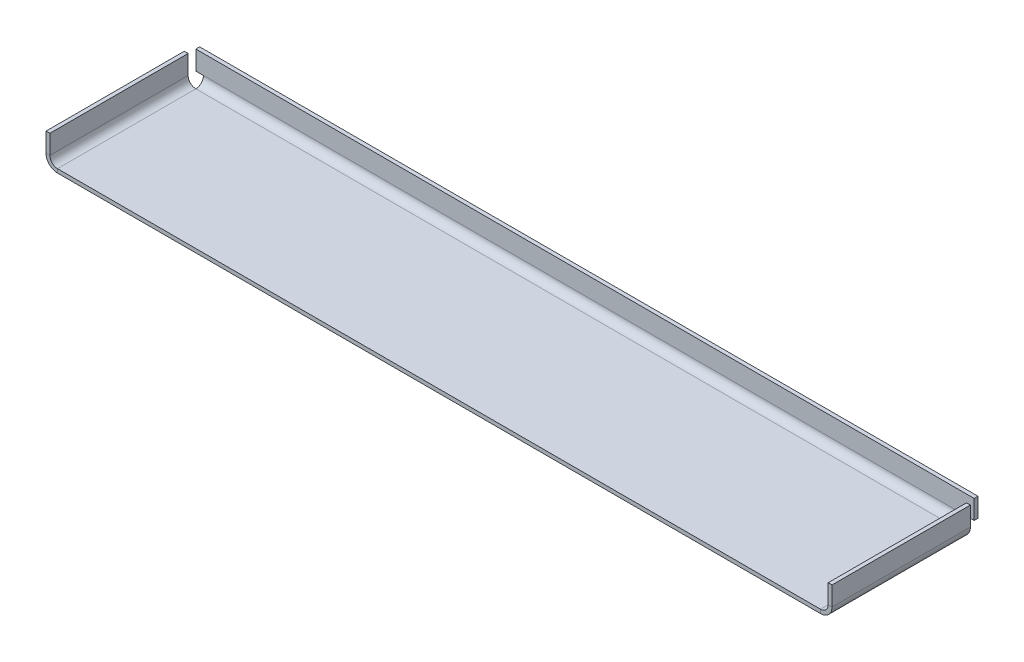
ISO-10303-21;
HEADER;
FILE_DESCRIPTION(('STEP AP214'),'2;1');
FILE_NAME('part.step','',(''),(''),'','','');
FILE_SCHEMA(('AUTOMOTIVE_DESIGN { 1 0 10303 214 1 1 1 1 }'));
ENDSEC;
DATA;
#1=APPLICATION_CONTEXT('core data for automotive mechanical design processes');
#2=APPLICATION_PROTOCOL_DEFINITION('international standard','automotive_design',2000,#1);
#3=PRODUCT_CONTEXT('',#1,'mechanical');
#4=PRODUCT('Part','Part','',(#3));
#5=PRODUCT_RELATED_PRODUCT_CATEGORY('part','',(#4));
#6=PRODUCT_DEFINITION_FORMATION('','',#4);
#7=PRODUCT_DEFINITION_CONTEXT('part definition',#1,'design');
#8=PRODUCT_DEFINITION('design','',#6,#7);
#9=PRODUCT_DEFINITION_SHAPE('','',#8);
#10=(LENGTH_UNIT() NAMED_UNIT(*) SI_UNIT(.MILLI.,.METRE.));
#11=(NAMED_UNIT(*) PLANE_ANGLE_UNIT() SI_UNIT($,.RADIAN.));
#12=(NAMED_UNIT(*) SI_UNIT($,.STERADIAN.) SOLID_ANGLE_UNIT());
#13=UNCERTAINTY_MEASURE_WITH_UNIT(LENGTH_MEASURE(1.E-05),#10,'distance_accuracy_value','');
#14=(GEOMETRIC_REPRESENTATION_CONTEXT(3) GLOBAL_UNCERTAINTY_ASSIGNED_CONTEXT((#13)) GLOBAL_UNIT_ASSIGNED_CONTEXT((#10,
#11,#12)) REPRESENTATION_CONTEXT('',''));
#15=CARTESIAN_POINT('',(0.,0.,0.));
#16=DIRECTION('',(0.,0.,1.));
#17=DIRECTION('',(1.,0.,0.));
#18=AXIS2_PLACEMENT_3D('',#15,#16,#17);
#19=CARTESIAN_POINT('',(0.,6.34999999999913,0.));
#20=DIRECTION('',(0.,1.,0.));
#21=DIRECTION('',(0.,0.,1.));
#22=AXIS2_PLACEMENT_3D('',#19,#20,#21);
#23=PLANE('',#22);
#24=DIRECTION('',(0.,0.,1.));
#25=VECTOR('',#24,1.);
#26=CARTESIAN_POINT('',(639.30784,6.35,-124.25172));
#27=LINE('',#26,#25);
#28=CARTESIAN_POINT('',(639.30784,6.35,-124.25172));
#29=VERTEX_POINT('',#28);
#30=CARTESIAN_POINT('',(639.30784,6.34999999999998,-121.07672));
#31=VERTEX_POINT('',#30);
#32=EDGE_CURVE('E12',#29,#31,#27,.T.);
#33=ORIENTED_EDGE('',*,*,#32,.F.);
#34=DIRECTION('',(1.,0.,0.));
#35=VECTOR('',#34,1.);
#36=CARTESIAN_POINT('',(0.,6.35000000000002,-124.25172));
#37=LINE('',#36,#35);
#38=CARTESIAN_POINT('',(645.65784,6.34999999999991,-124.25172));
#39=VERTEX_POINT('',#38);
#40=EDGE_CURVE('E287',#29,#39,#37,.T.);
#41=ORIENTED_EDGE('',*,*,#40,.T.);
#42=DIRECTION('',(0.,0.,-1.));
#43=VECTOR('',#42,1.);
#44=CARTESIAN_POINT('',(645.65784,6.34999999999998,-121.07672));
#45=LINE('',#44,#43);
#46=CARTESIAN_POINT('',(645.65784,6.34999999999992,-121.07672));
#47=VERTEX_POINT('',#46);
#48=EDGE_CURVE('E278',#47,#39,#45,.T.);
#49=ORIENTED_EDGE('',*,*,#48,.F.);
#50=DIRECTION('',(-1.,0.,0.));
#51=VECTOR('',#50,1.);
#52=CARTESIAN_POINT('',(645.65784,6.34999999999998,-121.07672));
#53=LINE('',#52,#51);
#54=EDGE_CURVE('E281',#47,#31,#53,.T.);
#55=ORIENTED_EDGE('',*,*,#54,.T.);
#56=EDGE_LOOP('',(#33,#41,#49,#55));
#57=FACE_BOUND('',#56,.T.);
#58=ADVANCED_FACE('F42',(#57),#23,.F.);
#59=CARTESIAN_POINT('',(0.,6.34999999999994,-114.72672));
#60=DIRECTION('',(-1.,0.,0.));
#61=DIRECTION('',(0.,0.,-1.));
#62=AXIS2_PLACEMENT_3D('',#59,#60,#61);
#63=CYLINDRICAL_SURFACE('',#62,9.525);
#64=CARTESIAN_POINT('',(6.34999999999999,6.35000000000002,-124.25172));
#65=VERTEX_POINT('',#64);
#66=EDGE_CURVE('E294',#65,#29,#37,.T.);
#67=ORIENTED_EDGE('',*,*,#66,.T.);
#68=CARTESIAN_POINT('',(639.30784,6.34999999999994,-114.72672));
#69=DIRECTION('',(1.,0.,0.));
#70=DIRECTION('',(0.,0.,-1.));
#71=AXIS2_PLACEMENT_3D('',#68,#69,#70);
#72=CIRCLE('',#71,9.525);
#73=CARTESIAN_POINT('',(639.30784,-3.17499999999997,-114.72672));
#74=VERTEX_POINT('',#73);
#75=EDGE_CURVE('E334',#29,#74,#72,.F.);
#76=ORIENTED_EDGE('',*,*,#75,.T.);
#77=DIRECTION('',(-1.,0.,0.));
#78=VECTOR('',#77,1.);
#79=CARTESIAN_POINT('',(0.,-3.17500000000005,-114.72672));
#80=LINE('',#79,#78);
#81=CARTESIAN_POINT('',(6.35,-3.17500000000005,-114.72672));
#82=VERTEX_POINT('',#81);
#83=EDGE_CURVE('E315',#82,#74,#80,.F.);
#84=ORIENTED_EDGE('',*,*,#83,.F.);
#85=CARTESIAN_POINT('',(6.35,6.34999999999994,-114.72672));
#86=DIRECTION('',(-1.,0.,0.));
#87=DIRECTION('',(0.,0.,1.));
#88=AXIS2_PLACEMENT_3D('',#85,#86,#87);
#89=CIRCLE('',#88,9.525);
#90=EDGE_CURVE('E329',#82,#65,#89,.F.);
#91=ORIENTED_EDGE('',*,*,#90,.T.);
#92=EDGE_LOOP('',(#67,#76,#84,#91));
#93=FACE_BOUND('',#92,.T.);
#94=ADVANCED_FACE('F391',(#93),#63,.T.);
#95=CARTESIAN_POINT('',(0.,-3.175,0.));
#96=DIRECTION('',(0.,-1.,0.));
#97=DIRECTION('',(0.,0.,-1.));
#98=AXIS2_PLACEMENT_3D('',#95,#96,#97);
#99=PLANE('',#98);
#100=ORIENTED_EDGE('',*,*,#83,.T.);
#101=DIRECTION('',(0.,0.,-1.));
#102=VECTOR('',#101,1.);
#103=CARTESIAN_POINT('',(639.30784,-3.17499999999997,-114.72672));
#104=LINE('',#103,#102);
#105=CARTESIAN_POINT('',(639.30784,-3.175,0.));
#106=VERTEX_POINT('',#105);
#107=EDGE_CURVE('E169',#74,#106,#104,.F.);
#108=ORIENTED_EDGE('',*,*,#107,.T.);
#109=DIRECTION('',(1.,0.,0.));
#110=VECTOR('',#109,1.);
#111=CARTESIAN_POINT('',(0.,-3.175,0.));
#112=LINE('',#111,#110);
#113=CARTESIAN_POINT('',(6.35,-3.17500000000002,0.));
#114=VERTEX_POINT('',#113);
#115=EDGE_CURVE('E321',#114,#106,#112,.T.);
#116=ORIENTED_EDGE('',*,*,#115,.F.);
#117=DIRECTION('',(0.,0.,1.));
#118=VECTOR('',#117,1.);
#119=CARTESIAN_POINT('',(6.35,-3.17500000000002,0.));
#120=LINE('',#119,#118);
#121=EDGE_CURVE('E258',#114,#82,#120,.F.);
#122=ORIENTED_EDGE('',*,*,#121,.T.);
#123=EDGE_LOOP('',(#100,#108,#116,#122));
#124=FACE_BOUND('',#123,.T.);
#125=ADVANCED_FACE('F388',(#124),#99,.T.);
#126=CARTESIAN_POINT('',(0.,0.,0.));
#127=DIRECTION('',(0.,-1.,0.));
#128=DIRECTION('',(0.,0.,-1.));
#129=AXIS2_PLACEMENT_3D('',#126,#127,#128);
#130=PLANE('',#129);
#131=DIRECTION('',(0.,0.,-1.));
#132=VECTOR('',#131,1.);
#133=CARTESIAN_POINT('',(639.30784,0.,-114.72672));
#134=LINE('',#133,#132);
#135=CARTESIAN_POINT('',(639.30784,0.,-114.72672));
#136=VERTEX_POINT('',#135);
#137=CARTESIAN_POINT('',(639.30784,0.,0.));
#138=VERTEX_POINT('',#137);
#139=EDGE_CURVE('E219',#136,#138,#134,.F.);
#140=ORIENTED_EDGE('',*,*,#139,.F.);
#141=DIRECTION('',(-1.,0.,0.));
#142=VECTOR('',#141,1.);
#143=CARTESIAN_POINT('',(0.,0.,-114.72672));
#144=LINE('',#143,#142);
#145=CARTESIAN_POINT('',(6.35,0.,-114.72672));
#146=VERTEX_POINT('',#145);
#147=EDGE_CURVE('E314',#146,#136,#144,.F.);
#148=ORIENTED_EDGE('',*,*,#147,.F.);
#149=DIRECTION('',(0.,0.,1.));
#150=VECTOR('',#149,1.);
#151=CARTESIAN_POINT('',(6.35,0.,0.));
#152=LINE('',#151,#150);
#153=CARTESIAN_POINT('',(6.35,0.,0.));
#154=VERTEX_POINT('',#153);
#155=EDGE_CURVE('E271',#154,#146,#152,.F.);
#156=ORIENTED_EDGE('',*,*,#155,.F.);
#157=DIRECTION('',(1.,0.,0.));
#158=VECTOR('',#157,1.);
#159=CARTESIAN_POINT('',(0.,0.,0.));
#160=LINE('',#159,#158);
#161=EDGE_CURVE('E318',#154,#138,#160,.T.);
#162=ORIENTED_EDGE('',*,*,#161,.T.);
#163=EDGE_LOOP('',(#140,#148,#156,#162));
#164=FACE_BOUND('',#163,.T.);
#165=ADVANCED_FACE('F341',(#164),#130,.F.);
#166=CARTESIAN_POINT('',(0.,6.34999999999913,0.));
#167=DIRECTION('',(0.,1.,0.));
#168=DIRECTION('',(0.,0.,1.));
#169=AXIS2_PLACEMENT_3D('',#166,#167,#168);
#170=PLANE('',#169);
#171=DIRECTION('',(0.,0.,-1.));
#172=VECTOR('',#171,1.);
#173=CARTESIAN_POINT('',(6.34999999999997,6.34999999999999,-121.07672));
#174=LINE('',#173,#172);
#175=CARTESIAN_POINT('',(6.34999999999997,6.34999999999999,-121.07672));
#176=VERTEX_POINT('',#175);
#177=EDGE_CURVE('E332',#176,#65,#174,.T.);
#178=ORIENTED_EDGE('',*,*,#177,.F.);
#179=CARTESIAN_POINT('',(0.,6.34999999999992,-121.07672));
#180=VERTEX_POINT('',#179);
#181=EDGE_CURVE('E285',#176,#180,#53,.T.);
#182=ORIENTED_EDGE('',*,*,#181,.T.);
#183=DIRECTION('',(0.,0.,-1.));
#184=VECTOR('',#183,1.);
#185=CARTESIAN_POINT('',(0.,6.34999999999999,-121.07672));
#186=LINE('',#185,#184);
#187=CARTESIAN_POINT('',(0.,6.35000000000002,-124.25172));
#188=VERTEX_POINT('',#187);
#189=EDGE_CURVE('E283',#180,#188,#186,.T.);
#190=ORIENTED_EDGE('',*,*,#189,.T.);
#191=EDGE_CURVE('E290',#188,#65,#37,.T.);
#192=ORIENTED_EDGE('',*,*,#191,.T.);
#193=EDGE_LOOP('',(#178,#182,#190,#192));
#194=FACE_BOUND('',#193,.T.);
#195=ADVANCED_FACE('F409',(#194),#170,.F.);
#196=CARTESIAN_POINT('',(639.30784,6.34999999999994,-114.72672));
#197=DIRECTION('',(1.,0.,0.));
#198=DIRECTION('',(0.,0.,-1.));
#199=AXIS2_PLACEMENT_3D('',#196,#197,#198);
#200=PLANE('',#199);
#201=ORIENTED_EDGE('',*,*,#75,.F.);
#202=ORIENTED_EDGE('',*,*,#32,.T.);
#203=CARTESIAN_POINT('',(639.30784,6.34999999999994,-114.72672));
#204=DIRECTION('',(1.,0.,0.));
#205=DIRECTION('',(0.,0.,-1.));
#206=AXIS2_PLACEMENT_3D('',#203,#204,#205);
#207=CIRCLE('',#206,6.34999999999999);
#208=EDGE_CURVE('E49',#31,#136,#207,.F.);
#209=ORIENTED_EDGE('',*,*,#208,.T.);
#210=DIRECTION('',(0.,-1.,0.));
#211=VECTOR('',#210,1.);
#212=CARTESIAN_POINT('',(639.30784,0.,-114.72672));
#213=LINE('',#212,#211);
#214=EDGE_CURVE('E215',#136,#74,#213,.T.);
#215=ORIENTED_EDGE('',*,*,#214,.T.);
#216=EDGE_LOOP('',(#201,#202,#209,#215));
#217=FACE_BOUND('',#216,.T.);
#218=ADVANCED_FACE('F336',(#217),#200,.T.);
#219=CARTESIAN_POINT('',(6.35,6.34999999999994,-114.72672));
#220=DIRECTION('',(-1.,0.,0.));
#221=DIRECTION('',(0.,0.,1.));
#222=AXIS2_PLACEMENT_3D('',#219,#220,#221);
#223=PLANE('',#222);
#224=CARTESIAN_POINT('',(6.35,6.34999999999994,-114.72672));
#225=DIRECTION('',(-1.,0.,0.));
#226=DIRECTION('',(0.,0.,1.));
#227=AXIS2_PLACEMENT_3D('',#224,#225,#226);
#228=CIRCLE('',#227,6.34999999999999);
#229=EDGE_CURVE('E324',#146,#176,#228,.F.);
#230=ORIENTED_EDGE('',*,*,#229,.T.);
#231=ORIENTED_EDGE('',*,*,#177,.T.);
#232=ORIENTED_EDGE('',*,*,#90,.F.);
#233=DIRECTION('',(0.,-1.,0.));
#234=VECTOR('',#233,1.);
#235=CARTESIAN_POINT('',(6.35,0.,-114.72672));
#236=LINE('',#235,#234);
#237=EDGE_CURVE('E275',#146,#82,#236,.T.);
#238=ORIENTED_EDGE('',*,*,#237,.F.);
#239=EDGE_LOOP('',(#230,#231,#232,#238));
#240=FACE_BOUND('',#239,.T.);
#241=ADVANCED_FACE('F353',(#240),#223,.T.);
#242=CARTESIAN_POINT('',(0.,-3.175,0.));
#243=DIRECTION('',(0.,0.,1.));
#244=DIRECTION('',(1.,0.,0.));
#245=AXIS2_PLACEMENT_3D('',#242,#243,#244);
#246=PLANE('',#245);
#247=DIRECTION('',(0.,-1.,0.));
#248=VECTOR('',#247,1.);
#249=CARTESIAN_POINT('',(639.30784,0.,0.));
#250=LINE('',#249,#248);
#251=EDGE_CURVE('E222',#138,#106,#250,.T.);
#252=ORIENTED_EDGE('',*,*,#251,.F.);
#253=ORIENTED_EDGE('',*,*,#161,.F.);
#254=DIRECTION('',(0.,-1.,0.));
#255=VECTOR('',#254,1.);
#256=CARTESIAN_POINT('',(6.35,0.,0.));
#257=LINE('',#256,#255);
#258=EDGE_CURVE('E265',#154,#114,#257,.T.);
#259=ORIENTED_EDGE('',*,*,#258,.T.);
#260=ORIENTED_EDGE('',*,*,#115,.T.);
#261=EDGE_LOOP('',(#252,#253,#259,#260));
#262=FACE_BOUND('',#261,.T.);
#263=ADVANCED_FACE('F438',(#262),#246,.T.);
#264=CARTESIAN_POINT('',(0.,6.34999999999994,-114.72672));
#265=DIRECTION('',(-1.,0.,0.));
#266=DIRECTION('',(0.,0.,-1.));
#267=AXIS2_PLACEMENT_3D('',#264,#265,#266);
#268=CYLINDRICAL_SURFACE('',#267,6.34999999999999);
#269=ORIENTED_EDGE('',*,*,#208,.F.);
#270=EDGE_CURVE('E284',#31,#176,#53,.T.);
#271=ORIENTED_EDGE('',*,*,#270,.T.);
#272=ORIENTED_EDGE('',*,*,#229,.F.);
#273=ORIENTED_EDGE('',*,*,#147,.T.);
#274=EDGE_LOOP('',(#269,#271,#272,#273));
#275=FACE_BOUND('',#274,.T.);
#276=ADVANCED_FACE('F347',(#275),#268,.F.);
#277=CARTESIAN_POINT('',(0.,22.225,-124.25172));
#278=DIRECTION('',(1.,0.,0.));
#279=DIRECTION('',(0.,0.,-1.));
#280=AXIS2_PLACEMENT_3D('',#277,#278,#279);
#281=PLANE('',#280);
#282=ORIENTED_EDGE('',*,*,#189,.F.);
#283=DIRECTION('',(0.,1.,0.));
#284=VECTOR('',#283,1.);
#285=CARTESIAN_POINT('',(0.,22.225,-121.07672));
#286=LINE('',#285,#284);
#287=CARTESIAN_POINT('',(0.,22.225,-121.07672));
#288=VERTEX_POINT('',#287);
#289=EDGE_CURVE('E293',#180,#288,#286,.T.);
#290=ORIENTED_EDGE('',*,*,#289,.T.);
#291=DIRECTION('',(0.,0.,1.));
#292=VECTOR('',#291,1.);
#293=CARTESIAN_POINT('',(0.,22.225,-124.25172));
#294=LINE('',#293,#292);
#295=CARTESIAN_POINT('',(0.,22.225,-124.25172));
#296=VERTEX_POINT('',#295);
#297=EDGE_CURVE('E311',#296,#288,#294,.T.);
#298=ORIENTED_EDGE('',*,*,#297,.F.);
#299=DIRECTION('',(0.,1.,0.));
#300=VECTOR('',#299,1.);
#301=CARTESIAN_POINT('',(0.,22.225,-124.25172));
#302=LINE('',#301,#300);
#303=EDGE_CURVE('E295',#188,#296,#302,.T.);
#304=ORIENTED_EDGE('',*,*,#303,.F.);
#305=EDGE_LOOP('',(#282,#290,#298,#304));
#306=FACE_BOUND('',#305,.T.);
#307=ADVANCED_FACE('F412',(#306),#281,.F.);
#308=CARTESIAN_POINT('',(645.65784,0.,-124.25172));
#309=DIRECTION('',(-1.,0.,0.));
#310=DIRECTION('',(0.,0.,1.));
#311=AXIS2_PLACEMENT_3D('',#308,#309,#310);
#312=PLANE('',#311);
#313=ORIENTED_EDGE('',*,*,#48,.T.);
#314=DIRECTION('',(0.,-1.,0.));
#315=VECTOR('',#314,1.);
#316=CARTESIAN_POINT('',(645.65784,0.,-124.25172));
#317=LINE('',#316,#315);
#318=CARTESIAN_POINT('',(645.65784,22.225,-124.25172));
#319=VERTEX_POINT('',#318);
#320=EDGE_CURVE('E300',#319,#39,#317,.T.);
#321=ORIENTED_EDGE('',*,*,#320,.F.);
#322=DIRECTION('',(0.,0.,1.));
#323=VECTOR('',#322,1.);
#324=CARTESIAN_POINT('',(645.65784,22.225,-124.25172));
#325=LINE('',#324,#323);
#326=CARTESIAN_POINT('',(645.65784,22.225,-121.07672));
#327=VERTEX_POINT('',#326);
#328=EDGE_CURVE('E303',#319,#327,#325,.T.);
#329=ORIENTED_EDGE('',*,*,#328,.T.);
#330=DIRECTION('',(0.,-1.,0.));
#331=VECTOR('',#330,1.);
#332=CARTESIAN_POINT('',(645.65784,0.,-121.07672));
#333=LINE('',#332,#331);
#334=EDGE_CURVE('E298',#327,#47,#333,.T.);
#335=ORIENTED_EDGE('',*,*,#334,.T.);
#336=EDGE_LOOP('',(#313,#321,#329,#335));
#337=FACE_BOUND('',#336,.T.);
#338=ADVANCED_FACE('F400',(#337),#312,.F.);
#339=CARTESIAN_POINT('',(0.,-4.64703548717958E-13,-124.25172));
#340=DIRECTION('',(0.,0.,1.));
#341=DIRECTION('',(0.,-1.,0.));
#342=AXIS2_PLACEMENT_3D('',#339,#340,#341);
#343=PLANE('',#342);
#344=ORIENTED_EDGE('',*,*,#191,.F.);
#345=ORIENTED_EDGE('',*,*,#303,.T.);
#346=DIRECTION('',(1.,0.,0.));
#347=VECTOR('',#346,1.);
#348=CARTESIAN_POINT('',(645.65784,22.225,-124.25172));
#349=LINE('',#348,#347);
#350=EDGE_CURVE('E297',#296,#319,#349,.T.);
#351=ORIENTED_EDGE('',*,*,#350,.T.);
#352=ORIENTED_EDGE('',*,*,#320,.T.);
#353=ORIENTED_EDGE('',*,*,#40,.F.);
#354=ORIENTED_EDGE('',*,*,#66,.F.);
#355=EDGE_LOOP('',(#344,#345,#351,#352,#353,#354));
#356=FACE_BOUND('',#355,.T.);
#357=ADVANCED_FACE('F396',(#356),#343,.F.);
#358=CARTESIAN_POINT('',(0.,-4.53618095467131E-13,-121.07672));
#359=DIRECTION('',(0.,0.,1.));
#360=DIRECTION('',(0.,-1.,0.));
#361=AXIS2_PLACEMENT_3D('',#358,#359,#360);
#362=PLANE('',#361);
#363=ORIENTED_EDGE('',*,*,#289,.F.);
#364=ORIENTED_EDGE('',*,*,#181,.F.);
#365=ORIENTED_EDGE('',*,*,#270,.F.);
#366=ORIENTED_EDGE('',*,*,#54,.F.);
#367=ORIENTED_EDGE('',*,*,#334,.F.);
#368=DIRECTION('',(1.,0.,0.));
#369=VECTOR('',#368,1.);
#370=CARTESIAN_POINT('',(645.65784,22.225,-121.07672));
#371=LINE('',#370,#369);
#372=EDGE_CURVE('E305',#288,#327,#371,.T.);
#373=ORIENTED_EDGE('',*,*,#372,.F.);
#374=EDGE_LOOP('',(#363,#364,#365,#366,#367,#373));
#375=FACE_BOUND('',#374,.T.);
#376=ADVANCED_FACE('F406',(#375),#362,.T.);
#377=CARTESIAN_POINT('',(645.65784,22.225,-124.25172));
#378=DIRECTION('',(0.,-1.,0.));
#379=DIRECTION('',(0.,0.,-1.));
#380=AXIS2_PLACEMENT_3D('',#377,#378,#379);
#381=PLANE('',#380);
#382=ORIENTED_EDGE('',*,*,#372,.T.);
#383=ORIENTED_EDGE('',*,*,#328,.F.);
#384=ORIENTED_EDGE('',*,*,#350,.F.);
#385=ORIENTED_EDGE('',*,*,#297,.T.);
#386=EDGE_LOOP('',(#382,#383,#384,#385));
#387=FACE_BOUND('',#386,.T.);
#388=ADVANCED_FACE('F416',(#387),#381,.F.);
#389=CARTESIAN_POINT('',(6.35,6.34999999999995,-114.72672));
#390=DIRECTION('',(0.,0.,-1.));
#391=DIRECTION('',(0.,1.,0.));
#392=AXIS2_PLACEMENT_3D('',#389,#390,#391);
#393=PLANE('',#392);
#394=DIRECTION('',(-1.,0.,0.));
#395=VECTOR('',#394,1.);
#396=CARTESIAN_POINT('',(0.,6.34999999999993,-114.72672));
#397=LINE('',#396,#395);
#398=CARTESIAN_POINT('',(0.,6.34999999999992,-114.72672));
#399=VERTEX_POINT('',#398);
#400=CARTESIAN_POINT('',(-3.17500000000002,6.34999999999991,-114.72672));
#401=VERTEX_POINT('',#400);
#402=EDGE_CURVE('E225',#399,#401,#397,.T.);
#403=ORIENTED_EDGE('',*,*,#402,.F.);
#404=CARTESIAN_POINT('',(6.35,6.34999999999995,-114.72672));
#405=DIRECTION('',(0.,0.,1.));
#406=DIRECTION('',(0.,-1.,0.));
#407=AXIS2_PLACEMENT_3D('',#404,#405,#406);
#408=CIRCLE('',#407,6.35000000000002);
#409=EDGE_CURVE('E268',#146,#399,#408,.F.);
#410=ORIENTED_EDGE('',*,*,#409,.F.);
#411=ORIENTED_EDGE('',*,*,#237,.T.);
#412=CARTESIAN_POINT('',(6.35,6.34999999999995,-114.72672));
#413=DIRECTION('',(0.,0.,1.));
#414=DIRECTION('',(0.,-1.,0.));
#415=AXIS2_PLACEMENT_3D('',#412,#413,#414);
#416=CIRCLE('',#415,9.52500000000002);
#417=EDGE_CURVE('E261',#82,#401,#416,.F.);
#418=ORIENTED_EDGE('',*,*,#417,.T.);
#419=EDGE_LOOP('',(#403,#410,#411,#418));
#420=FACE_BOUND('',#419,.T.);
#421=ADVANCED_FACE('F356',(#420),#393,.T.);
#422=CARTESIAN_POINT('',(6.35000000000001,6.35,0.));
#423=DIRECTION('',(0.,0.,-1.));
#424=DIRECTION('',(0.,1.,0.));
#425=AXIS2_PLACEMENT_3D('',#422,#423,#424);
#426=PLANE('',#425);
#427=CARTESIAN_POINT('',(6.35000000000001,6.35,0.));
#428=DIRECTION('',(0.,0.,1.));
#429=DIRECTION('',(0.,-1.,0.));
#430=AXIS2_PLACEMENT_3D('',#427,#428,#429);
#431=CIRCLE('',#430,6.35000000000002);
#432=CARTESIAN_POINT('',(0.,6.34999999999998,0.));
#433=VERTEX_POINT('',#432);
#434=EDGE_CURVE('E257',#433,#154,#431,.T.);
#435=ORIENTED_EDGE('',*,*,#434,.F.);
#436=DIRECTION('',(-1.,0.,0.));
#437=VECTOR('',#436,1.);
#438=CARTESIAN_POINT('',(0.,6.34999999999998,0.));
#439=LINE('',#438,#437);
#440=CARTESIAN_POINT('',(-3.17500000000002,6.34999999999997,0.));
#441=VERTEX_POINT('',#440);
#442=EDGE_CURVE('E230',#433,#441,#439,.T.);
#443=ORIENTED_EDGE('',*,*,#442,.T.);
#444=CARTESIAN_POINT('',(6.35000000000001,6.35,0.));
#445=DIRECTION('',(0.,0.,1.));
#446=DIRECTION('',(0.,-1.,0.));
#447=AXIS2_PLACEMENT_3D('',#444,#445,#446);
#448=CIRCLE('',#447,9.52500000000002);
#449=EDGE_CURVE('E262',#441,#114,#448,.T.);
#450=ORIENTED_EDGE('',*,*,#449,.T.);
#451=ORIENTED_EDGE('',*,*,#258,.F.);
#452=EDGE_LOOP('',(#435,#443,#450,#451));
#453=FACE_BOUND('',#452,.T.);
#454=ADVANCED_FACE('F380',(#453),#426,.F.);
#455=CARTESIAN_POINT('',(6.35000000000001,6.35,0.));
#456=DIRECTION('',(0.,0.,1.));
#457=DIRECTION('',(-1.,0.,0.));
#458=AXIS2_PLACEMENT_3D('',#455,#456,#457);
#459=CYLINDRICAL_SURFACE('',#458,9.52500000000002);
#460=ORIENTED_EDGE('',*,*,#121,.F.);
#461=ORIENTED_EDGE('',*,*,#449,.F.);
#462=DIRECTION('',(0.,0.,-1.));
#463=VECTOR('',#462,1.);
#464=CARTESIAN_POINT('',(-3.17500000000002,6.34999999999997,0.));
#465=LINE('',#464,#463);
#466=EDGE_CURVE('E233',#441,#401,#465,.T.);
#467=ORIENTED_EDGE('',*,*,#466,.T.);
#468=ORIENTED_EDGE('',*,*,#417,.F.);
#469=EDGE_LOOP('',(#460,#461,#467,#468));
#470=FACE_BOUND('',#469,.T.);
#471=ADVANCED_FACE('F384',(#470),#459,.T.);
#472=CARTESIAN_POINT('',(6.35000000000001,6.35,0.));
#473=DIRECTION('',(0.,0.,1.));
#474=DIRECTION('',(-1.,0.,0.));
#475=AXIS2_PLACEMENT_3D('',#472,#473,#474);
#476=CYLINDRICAL_SURFACE('',#475,6.35000000000002);
#477=ORIENTED_EDGE('',*,*,#155,.T.);
#478=ORIENTED_EDGE('',*,*,#409,.T.);
#479=DIRECTION('',(0.,0.,1.));
#480=VECTOR('',#479,1.);
#481=CARTESIAN_POINT('',(0.,6.34999999999993,-114.72672));
#482=LINE('',#481,#480);
#483=EDGE_CURVE('E228',#399,#433,#482,.T.);
#484=ORIENTED_EDGE('',*,*,#483,.T.);
#485=ORIENTED_EDGE('',*,*,#434,.T.);
#486=EDGE_LOOP('',(#477,#478,#484,#485));
#487=FACE_BOUND('',#486,.T.);
#488=ADVANCED_FACE('F359',(#487),#476,.F.);
#489=CARTESIAN_POINT('',(-3.175,0.,-114.72672));
#490=DIRECTION('',(0.,0.,1.));
#491=DIRECTION('',(0.,-1.,0.));
#492=AXIS2_PLACEMENT_3D('',#489,#490,#491);
#493=PLANE('',#492);
#494=ORIENTED_EDGE('',*,*,#402,.T.);
#495=DIRECTION('',(0.,-1.,0.));
#496=VECTOR('',#495,1.);
#497=CARTESIAN_POINT('',(-3.175,0.,-114.72672));
#498=LINE('',#497,#496);
#499=CARTESIAN_POINT('',(-3.17500000000008,22.2249999999999,-114.72672));
#500=VERTEX_POINT('',#499);
#501=EDGE_CURVE('E238',#500,#401,#498,.T.);
#502=ORIENTED_EDGE('',*,*,#501,.F.);
#503=DIRECTION('',(1.,0.,0.));
#504=VECTOR('',#503,1.);
#505=CARTESIAN_POINT('',(-3.17500000000008,22.2249999999999,-114.72672));
#506=LINE('',#505,#504);
#507=CARTESIAN_POINT('',(0.,22.225,-114.72672));
#508=VERTEX_POINT('',#507);
#509=EDGE_CURVE('E246',#500,#508,#506,.T.);
#510=ORIENTED_EDGE('',*,*,#509,.T.);
#511=DIRECTION('',(0.,-1.,0.));
#512=VECTOR('',#511,1.);
#513=CARTESIAN_POINT('',(0.,0.,-114.72672));
#514=LINE('',#513,#512);
#515=EDGE_CURVE('E237',#508,#399,#514,.T.);
#516=ORIENTED_EDGE('',*,*,#515,.T.);
#517=EDGE_LOOP('',(#494,#502,#510,#516));
#518=FACE_BOUND('',#517,.T.);
#519=ADVANCED_FACE('F367',(#518),#493,.F.);
#520=CARTESIAN_POINT('',(-3.17500000000008,22.225,0.));
#521=DIRECTION('',(0.,0.,-1.));
#522=DIRECTION('',(0.,1.,0.));
#523=AXIS2_PLACEMENT_3D('',#520,#521,#522);
#524=PLANE('',#523);
#525=ORIENTED_EDGE('',*,*,#442,.F.);
#526=DIRECTION('',(0.,1.,0.));
#527=VECTOR('',#526,1.);
#528=CARTESIAN_POINT('',(0.,22.225,0.));
#529=LINE('',#528,#527);
#530=CARTESIAN_POINT('',(0.,22.225,0.));
#531=VERTEX_POINT('',#530);
#532=EDGE_CURVE('E249',#433,#531,#529,.T.);
#533=ORIENTED_EDGE('',*,*,#532,.T.);
#534=DIRECTION('',(1.,0.,0.));
#535=VECTOR('',#534,1.);
#536=CARTESIAN_POINT('',(-3.17500000000008,22.225,0.));
#537=LINE('',#536,#535);
#538=CARTESIAN_POINT('',(-3.17500000000008,22.225,0.));
#539=VERTEX_POINT('',#538);
#540=EDGE_CURVE('E254',#539,#531,#537,.T.);
#541=ORIENTED_EDGE('',*,*,#540,.F.);
#542=DIRECTION('',(0.,1.,0.));
#543=VECTOR('',#542,1.);
#544=CARTESIAN_POINT('',(-3.17500000000008,22.225,0.));
#545=LINE('',#544,#543);
#546=EDGE_CURVE('E241',#441,#539,#545,.T.);
#547=ORIENTED_EDGE('',*,*,#546,.F.);
#548=EDGE_LOOP('',(#525,#533,#541,#547));
#549=FACE_BOUND('',#548,.T.);
#550=ADVANCED_FACE('F377',(#549),#524,.F.);
#551=CARTESIAN_POINT('',(-3.175,0.,0.));
#552=DIRECTION('',(1.,0.,0.));
#553=DIRECTION('',(0.,1.,0.));
#554=AXIS2_PLACEMENT_3D('',#551,#552,#553);
#555=PLANE('',#554);
#556=ORIENTED_EDGE('',*,*,#466,.F.);
#557=ORIENTED_EDGE('',*,*,#546,.T.);
#558=DIRECTION('',(0.,0.,-1.));
#559=VECTOR('',#558,1.);
#560=CARTESIAN_POINT('',(-3.17500000000008,22.2249999999999,-114.72672));
#561=LINE('',#560,#559);
#562=EDGE_CURVE('E244',#539,#500,#561,.T.);
#563=ORIENTED_EDGE('',*,*,#562,.T.);
#564=ORIENTED_EDGE('',*,*,#501,.T.);
#565=EDGE_LOOP('',(#556,#557,#563,#564));
#566=FACE_BOUND('',#565,.T.);
#567=ADVANCED_FACE('F382',(#566),#555,.F.);
#568=CARTESIAN_POINT('',(0.,0.,0.));
#569=DIRECTION('',(1.,0.,0.));
#570=DIRECTION('',(0.,1.,0.));
#571=AXIS2_PLACEMENT_3D('',#568,#569,#570);
#572=PLANE('',#571);
#573=ORIENTED_EDGE('',*,*,#532,.F.);
#574=ORIENTED_EDGE('',*,*,#483,.F.);
#575=ORIENTED_EDGE('',*,*,#515,.F.);
#576=DIRECTION('',(0.,0.,-1.));
#577=VECTOR('',#576,1.);
#578=CARTESIAN_POINT('',(0.,22.225,-114.72672));
#579=LINE('',#578,#577);
#580=EDGE_CURVE('E242',#531,#508,#579,.T.);
#581=ORIENTED_EDGE('',*,*,#580,.F.);
#582=EDGE_LOOP('',(#573,#574,#575,#581));
#583=FACE_BOUND('',#582,.T.);
#584=ADVANCED_FACE('F364',(#583),#572,.T.);
#585=CARTESIAN_POINT('',(-3.17500000000008,22.2249999999999,-114.72672));
#586=DIRECTION('',(0.,-1.,0.));
#587=DIRECTION('',(1.,0.,0.));
#588=AXIS2_PLACEMENT_3D('',#585,#586,#587);
#589=PLANE('',#588);
#590=ORIENTED_EDGE('',*,*,#580,.T.);
#591=ORIENTED_EDGE('',*,*,#509,.F.);
#592=ORIENTED_EDGE('',*,*,#562,.F.);
#593=ORIENTED_EDGE('',*,*,#540,.T.);
#594=EDGE_LOOP('',(#590,#591,#592,#593));
#595=FACE_BOUND('',#594,.T.);
#596=ADVANCED_FACE('F372',(#595),#589,.F.);
#597=CARTESIAN_POINT('',(639.30784,6.35,0.));
#598=DIRECTION('',(0.,0.,1.));
#599=DIRECTION('',(1.,0.,0.));
#600=AXIS2_PLACEMENT_3D('',#597,#598,#599);
#601=PLANE('',#600);
#602=DIRECTION('',(1.,0.,0.));
#603=VECTOR('',#602,1.);
#604=CARTESIAN_POINT('',(645.65784,6.34999999999997,0.));
#605=LINE('',#604,#603);
#606=CARTESIAN_POINT('',(645.65784,6.34999999999997,0.));
#607=VERTEX_POINT('',#606);
#608=CARTESIAN_POINT('',(648.83284,6.34999999999995,0.));
#609=VERTEX_POINT('',#608);
#610=EDGE_CURVE('E751',#607,#609,#605,.T.);
#611=ORIENTED_EDGE('',*,*,#610,.F.);
#612=CARTESIAN_POINT('',(639.30784,6.35,0.));
#613=DIRECTION('',(0.,0.,-1.));
#614=DIRECTION('',(-1.,0.,0.));
#615=AXIS2_PLACEMENT_3D('',#612,#613,#614);
#616=CIRCLE('',#615,6.34999999999997);
#617=EDGE_CURVE('E172',#138,#607,#616,.F.);
#618=ORIENTED_EDGE('',*,*,#617,.F.);
#619=ORIENTED_EDGE('',*,*,#251,.T.);
#620=CARTESIAN_POINT('',(639.30784,6.35,0.));
#621=DIRECTION('',(0.,0.,-1.));
#622=DIRECTION('',(-1.,0.,0.));
#623=AXIS2_PLACEMENT_3D('',#620,#621,#622);
#624=CIRCLE('',#623,9.52499999999997);
#625=EDGE_CURVE('E214',#106,#609,#624,.F.);
#626=ORIENTED_EDGE('',*,*,#625,.T.);
#627=EDGE_LOOP('',(#611,#618,#619,#626));
#628=FACE_BOUND('',#627,.T.);
#629=ADVANCED_FACE('F567',(#628),#601,.T.);
#630=CARTESIAN_POINT('',(639.30784,6.35,-114.72672));
#631=DIRECTION('',(0.,0.,1.));
#632=DIRECTION('',(1.,0.,0.));
#633=AXIS2_PLACEMENT_3D('',#630,#631,#632);
#634=PLANE('',#633);
#635=CARTESIAN_POINT('',(639.30784,6.35,-114.72672));
#636=DIRECTION('',(0.,0.,-1.));
#637=DIRECTION('',(-1.,0.,0.));
#638=AXIS2_PLACEMENT_3D('',#635,#636,#637);
#639=CIRCLE('',#638,6.34999999999997);
#640=CARTESIAN_POINT('',(645.65784,6.34999999999997,-114.72672));
#641=VERTEX_POINT('',#640);
#642=EDGE_CURVE('E179',#641,#136,#639,.T.);
#643=ORIENTED_EDGE('',*,*,#642,.F.);
#644=DIRECTION('',(1.,0.,0.));
#645=VECTOR('',#644,1.);
#646=CARTESIAN_POINT('',(645.65784,6.34999999999997,-114.72672));
#647=LINE('',#646,#645);
#648=CARTESIAN_POINT('',(648.83284,6.34999999999995,-114.72672));
#649=VERTEX_POINT('',#648);
#650=EDGE_CURVE('E176',#641,#649,#647,.T.);
#651=ORIENTED_EDGE('',*,*,#650,.T.);
#652=CARTESIAN_POINT('',(639.30784,6.35,-114.72672));
#653=DIRECTION('',(0.,0.,-1.));
#654=DIRECTION('',(-1.,0.,0.));
#655=AXIS2_PLACEMENT_3D('',#652,#653,#654);
#656=CIRCLE('',#655,9.52499999999997);
#657=EDGE_CURVE('E162',#649,#74,#656,.T.);
#658=ORIENTED_EDGE('',*,*,#657,.T.);
#659=ORIENTED_EDGE('',*,*,#214,.F.);
#660=EDGE_LOOP('',(#643,#651,#658,#659));
#661=FACE_BOUND('',#660,.T.);
#662=ADVANCED_FACE('F177',(#661),#634,.F.);
#663=CARTESIAN_POINT('',(639.30784,6.35,-114.72672));
#664=DIRECTION('',(0.,0.,-1.));
#665=DIRECTION('',(1.,0.,0.));
#666=AXIS2_PLACEMENT_3D('',#663,#664,#665);
#667=CYLINDRICAL_SURFACE('',#666,9.52499999999997);
#668=ORIENTED_EDGE('',*,*,#107,.F.);
#669=ORIENTED_EDGE('',*,*,#657,.F.);
#670=DIRECTION('',(0.,0.,1.));
#671=VECTOR('',#670,1.);
#672=CARTESIAN_POINT('',(648.83284,6.34999999999995,0.));
#673=LINE('',#672,#671);
#674=EDGE_CURVE('E166',#649,#609,#673,.T.);
#675=ORIENTED_EDGE('',*,*,#674,.T.);
#676=ORIENTED_EDGE('',*,*,#625,.F.);
#677=EDGE_LOOP('',(#668,#669,#675,#676));
#678=FACE_BOUND('',#677,.T.);
#679=ADVANCED_FACE('F164',(#678),#667,.T.);
#680=CARTESIAN_POINT('',(639.30784,6.35,-114.72672));
#681=DIRECTION('',(0.,0.,-1.));
#682=DIRECTION('',(1.,0.,0.));
#683=AXIS2_PLACEMENT_3D('',#680,#681,#682);
#684=CYLINDRICAL_SURFACE('',#683,6.34999999999997);
#685=ORIENTED_EDGE('',*,*,#139,.T.);
#686=ORIENTED_EDGE('',*,*,#617,.T.);
#687=DIRECTION('',(0.,0.,-1.));
#688=VECTOR('',#687,1.);
#689=CARTESIAN_POINT('',(645.65784,6.34999999999997,0.));
#690=LINE('',#689,#688);
#691=EDGE_CURVE('E183',#607,#641,#690,.T.);
#692=ORIENTED_EDGE('',*,*,#691,.T.);
#693=ORIENTED_EDGE('',*,*,#642,.T.);
#694=EDGE_LOOP('',(#685,#686,#692,#693));
#695=FACE_BOUND('',#694,.T.);
#696=ADVANCED_FACE('F596',(#695),#684,.F.);
#697=CARTESIAN_POINT('',(648.83284,0.,0.));
#698=DIRECTION('',(0.,0.,-1.));
#699=DIRECTION('',(0.,1.,0.));
#700=AXIS2_PLACEMENT_3D('',#697,#698,#699);
#701=PLANE('',#700);
#702=ORIENTED_EDGE('',*,*,#610,.T.);
#703=DIRECTION('',(0.,-1.,0.));
#704=VECTOR('',#703,1.);
#705=CARTESIAN_POINT('',(648.83284,0.,0.));
#706=LINE('',#705,#704);
#707=CARTESIAN_POINT('',(648.83284,22.225,0.));
#708=VERTEX_POINT('',#707);
#709=EDGE_CURVE('E191',#708,#609,#706,.T.);
#710=ORIENTED_EDGE('',*,*,#709,.F.);
#711=DIRECTION('',(-1.,0.,0.));
#712=VECTOR('',#711,1.);
#713=CARTESIAN_POINT('',(648.83284,22.225,0.));
#714=LINE('',#713,#712);
#715=CARTESIAN_POINT('',(645.65784,22.225,0.));
#716=VERTEX_POINT('',#715);
#717=EDGE_CURVE('E200',#708,#716,#714,.T.);
#718=ORIENTED_EDGE('',*,*,#717,.T.);
#719=DIRECTION('',(0.,-1.,0.));
#720=VECTOR('',#719,1.);
#721=CARTESIAN_POINT('',(645.65784,0.,0.));
#722=LINE('',#721,#720);
#723=EDGE_CURVE('E192',#716,#607,#722,.T.);
#724=ORIENTED_EDGE('',*,*,#723,.T.);
#725=EDGE_LOOP('',(#702,#710,#718,#724));
#726=FACE_BOUND('',#725,.T.);
#727=ADVANCED_FACE('F606',(#726),#701,.F.);
#728=CARTESIAN_POINT('',(648.83284,22.2249999999999,-114.72672));
#729=DIRECTION('',(0.,0.,1.));
#730=DIRECTION('',(1.,0.,0.));
#731=AXIS2_PLACEMENT_3D('',#728,#729,#730);
#732=PLANE('',#731);
#733=ORIENTED_EDGE('',*,*,#650,.F.);
#734=DIRECTION('',(0.,1.,0.));
#735=VECTOR('',#734,1.);
#736=CARTESIAN_POINT('',(645.65784,22.225,-114.72672));
#737=LINE('',#736,#735);
#738=CARTESIAN_POINT('',(645.65784,22.225,-114.72672));
#739=VERTEX_POINT('',#738);
#740=EDGE_CURVE('E207',#641,#739,#737,.T.);
#741=ORIENTED_EDGE('',*,*,#740,.T.);
#742=DIRECTION('',(-1.,0.,0.));
#743=VECTOR('',#742,1.);
#744=CARTESIAN_POINT('',(648.83284,22.2249999999999,-114.72672));
#745=LINE('',#744,#743);
#746=CARTESIAN_POINT('',(648.83284,22.2249999999999,-114.72672));
#747=VERTEX_POINT('',#746);
#748=EDGE_CURVE('E196',#747,#739,#745,.T.);
#749=ORIENTED_EDGE('',*,*,#748,.F.);
#750=DIRECTION('',(0.,1.,0.));
#751=VECTOR('',#750,1.);
#752=CARTESIAN_POINT('',(648.83284,22.2249999999999,-114.72672));
#753=LINE('',#752,#751);
#754=EDGE_CURVE('E188',#649,#747,#753,.T.);
#755=ORIENTED_EDGE('',*,*,#754,.F.);
#756=EDGE_LOOP('',(#733,#741,#749,#755));
#757=FACE_BOUND('',#756,.T.);
#758=ADVANCED_FACE('F194',(#757),#732,.F.);
#759=CARTESIAN_POINT('',(648.83284,-3.23639119002358E-12,0.));
#760=DIRECTION('',(-1.,0.,0.));
#761=DIRECTION('',(0.,-1.,0.));
#762=AXIS2_PLACEMENT_3D('',#759,#760,#761);
#763=PLANE('',#762);
#764=ORIENTED_EDGE('',*,*,#674,.F.);
#765=ORIENTED_EDGE('',*,*,#754,.T.);
#766=DIRECTION('',(0.,0.,1.));
#767=VECTOR('',#766,1.);
#768=CARTESIAN_POINT('',(648.83284,22.225,0.));
#769=LINE('',#768,#767);
#770=EDGE_CURVE('E198',#747,#708,#769,.T.);
#771=ORIENTED_EDGE('',*,*,#770,.T.);
#772=ORIENTED_EDGE('',*,*,#709,.T.);
#773=EDGE_LOOP('',(#764,#765,#771,#772));
#774=FACE_BOUND('',#773,.T.);
#775=ADVANCED_FACE('F187',(#774),#763,.F.);
#776=CARTESIAN_POINT('',(645.65784,-3.22530573677276E-12,0.));
#777=DIRECTION('',(-1.,0.,0.));
#778=DIRECTION('',(0.,-1.,0.));
#779=AXIS2_PLACEMENT_3D('',#776,#777,#778);
#780=PLANE('',#779);
#781=ORIENTED_EDGE('',*,*,#740,.F.);
#782=ORIENTED_EDGE('',*,*,#691,.F.);
#783=ORIENTED_EDGE('',*,*,#723,.F.);
#784=DIRECTION('',(0.,0.,1.));
#785=VECTOR('',#784,1.);
#786=CARTESIAN_POINT('',(645.65784,22.225,0.));
#787=LINE('',#786,#785);
#788=EDGE_CURVE('E202',#739,#716,#787,.T.);
#789=ORIENTED_EDGE('',*,*,#788,.F.);
#790=EDGE_LOOP('',(#781,#782,#783,#789));
#791=FACE_BOUND('',#790,.T.);
#792=ADVANCED_FACE('F635',(#791),#780,.T.);
#793=CARTESIAN_POINT('',(648.83284,22.225,0.));
#794=DIRECTION('',(0.,-1.,0.));
#795=DIRECTION('',(1.,0.,0.));
#796=AXIS2_PLACEMENT_3D('',#793,#794,#795);
#797=PLANE('',#796);
#798=ORIENTED_EDGE('',*,*,#788,.T.);
#799=ORIENTED_EDGE('',*,*,#717,.F.);
#800=ORIENTED_EDGE('',*,*,#770,.F.);
#801=ORIENTED_EDGE('',*,*,#748,.T.);
#802=EDGE_LOOP('',(#798,#799,#800,#801));
#803=FACE_BOUND('',#802,.T.);
#804=ADVANCED_FACE('F645',(#803),#797,.F.);
#805=CLOSED_SHELL('',(#58,#94,#125,#165,#195,#218,#241,#263,#276,#307,#338,#357,#376,#388,#421,
#454,#471,#488,#519,#550,#567,#584,#596,#629,#662,#679,#696,#727,#758,#775,#792,#804));
#806=MANIFOLD_SOLID_BREP('B2',#805);
#807=ADVANCED_BREP_SHAPE_REPRESENTATION('',(#18,#806),#14);
#808=SHAPE_DEFINITION_REPRESENTATION(#9,#807);
ENDSEC;
END-ISO-10303-21;
